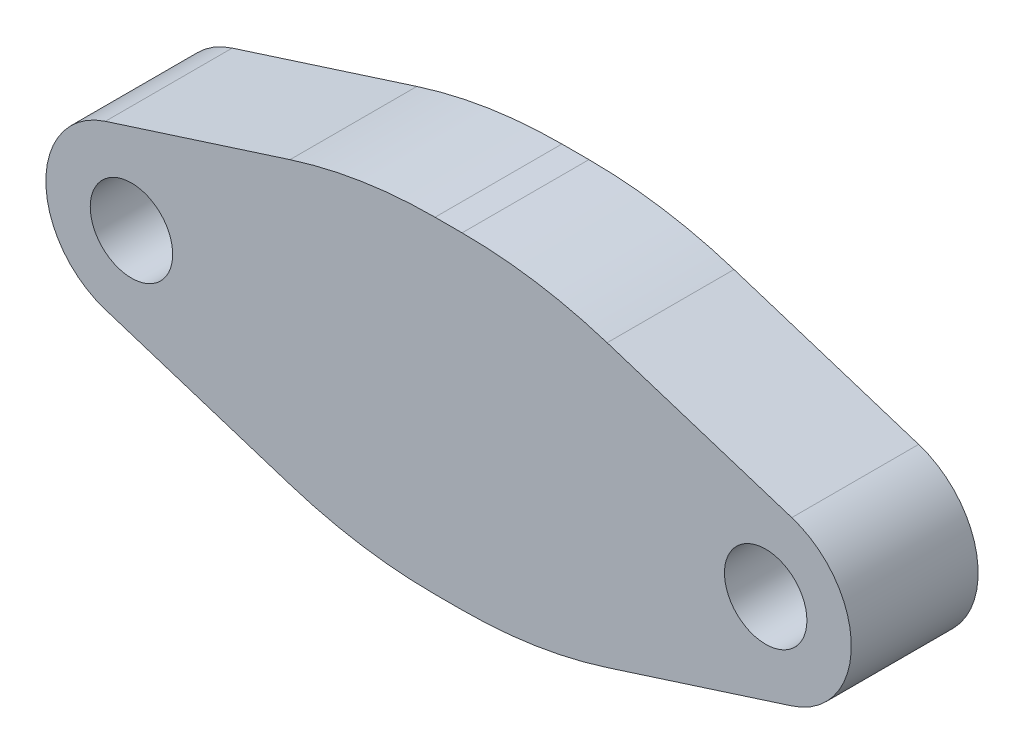
ISO-10303-21;
HEADER;
FILE_DESCRIPTION(('STEP AP214'),'2;1');
FILE_NAME('part.step','',(''),(''),'','','');
FILE_SCHEMA(('AUTOMOTIVE_DESIGN { 1 0 10303 214 1 1 1 1 }'));
ENDSEC;
DATA;
#1=APPLICATION_CONTEXT('core data for automotive mechanical design processes');
#2=APPLICATION_PROTOCOL_DEFINITION('international standard','automotive_design',2000,#1);
#3=PRODUCT_CONTEXT('',#1,'mechanical');
#4=PRODUCT('Part','Part','',(#3));
#5=PRODUCT_RELATED_PRODUCT_CATEGORY('part','',(#4));
#6=PRODUCT_DEFINITION_FORMATION('','',#4);
#7=PRODUCT_DEFINITION_CONTEXT('part definition',#1,'design');
#8=PRODUCT_DEFINITION('design','',#6,#7);
#9=PRODUCT_DEFINITION_SHAPE('','',#8);
#10=(LENGTH_UNIT() NAMED_UNIT(*) SI_UNIT(.MILLI.,.METRE.));
#11=(NAMED_UNIT(*) PLANE_ANGLE_UNIT() SI_UNIT($,.RADIAN.));
#12=(NAMED_UNIT(*) SI_UNIT($,.STERADIAN.) SOLID_ANGLE_UNIT());
#13=UNCERTAINTY_MEASURE_WITH_UNIT(LENGTH_MEASURE(1.E-05),#10,'distance_accuracy_value','');
#14=(GEOMETRIC_REPRESENTATION_CONTEXT(3) GLOBAL_UNCERTAINTY_ASSIGNED_CONTEXT((#13)) GLOBAL_UNIT_ASSIGNED_CONTEXT((#10,
#11,#12)) REPRESENTATION_CONTEXT('',''));
#15=CARTESIAN_POINT('',(0.,0.,0.));
#16=DIRECTION('',(0.,0.,1.));
#17=DIRECTION('',(1.,0.,0.));
#18=AXIS2_PLACEMENT_3D('',#15,#16,#17);
#19=CARTESIAN_POINT('',(4.33012701892219,0.,4.));
#20=DIRECTION('',(-0.866025403784439,-0.5,0.));
#21=DIRECTION('',(0.5,-0.866025403784439,0.));
#22=AXIS2_PLACEMENT_3D('',#19,#20,#21);
#23=PLANE('',#22);
#24=DIRECTION('',(0.,0.,-1.));
#25=VECTOR('',#24,1.);
#26=CARTESIAN_POINT('',(4.33012701892219,0.,4.));
#27=LINE('',#26,#25);
#28=CARTESIAN_POINT('',(4.33012701892219,0.,2.8));
#29=VERTEX_POINT('',#28);
#30=CARTESIAN_POINT('',(4.33012701892219,0.,0.));
#31=VERTEX_POINT('',#30);
#32=EDGE_CURVE('E56',#29,#31,#27,.T.);
#33=ORIENTED_EDGE('',*,*,#32,.F.);
#34=DIRECTION('',(-0.5,0.866025403784439,0.));
#35=VECTOR('',#34,1.);
#36=CARTESIAN_POINT('',(4.33012701892219,0.,2.8));
#37=LINE('',#36,#35);
#38=CARTESIAN_POINT('',(2.1650635094611,3.75,2.8));
#39=VERTEX_POINT('',#38);
#40=EDGE_CURVE('E50',#29,#39,#37,.T.);
#41=ORIENTED_EDGE('',*,*,#40,.T.);
#42=DIRECTION('',(0.,0.,-1.));
#43=VECTOR('',#42,1.);
#44=CARTESIAN_POINT('',(2.1650635094611,3.75,4.));
#45=LINE('',#44,#43);
#46=CARTESIAN_POINT('',(2.1650635094611,3.75,0.));
#47=VERTEX_POINT('',#46);
#48=EDGE_CURVE('E167',#39,#47,#45,.T.);
#49=ORIENTED_EDGE('',*,*,#48,.T.);
#50=DIRECTION('',(-0.5,0.866025403784439,0.));
#51=VECTOR('',#50,1.);
#52=CARTESIAN_POINT('',(4.33012701892219,0.,0.));
#53=LINE('',#52,#51);
#54=EDGE_CURVE('E169',#31,#47,#53,.T.);
#55=ORIENTED_EDGE('',*,*,#54,.F.);
#56=EDGE_LOOP('',(#33,#41,#49,#55));
#57=FACE_BOUND('',#56,.T.);
#58=ADVANCED_FACE('F35',(#57),#23,.T.);
#59=CARTESIAN_POINT('',(2.1650635094611,3.75,4.));
#60=DIRECTION('',(0.,-1.,0.));
#61=DIRECTION('',(0.,0.,-1.));
#62=AXIS2_PLACEMENT_3D('',#59,#60,#61);
#63=PLANE('',#62);
#64=ORIENTED_EDGE('',*,*,#48,.F.);
#65=DIRECTION('',(-1.,0.,0.));
#66=VECTOR('',#65,1.);
#67=CARTESIAN_POINT('',(2.1650635094611,3.75,2.8));
#68=LINE('',#67,#66);
#69=CARTESIAN_POINT('',(-2.1650635094611,3.75,2.8));
#70=VERTEX_POINT('',#69);
#71=EDGE_CURVE('E158',#39,#70,#68,.T.);
#72=ORIENTED_EDGE('',*,*,#71,.T.);
#73=DIRECTION('',(0.,0.,-1.));
#74=VECTOR('',#73,1.);
#75=CARTESIAN_POINT('',(-2.1650635094611,3.75,4.));
#76=LINE('',#75,#74);
#77=CARTESIAN_POINT('',(-2.1650635094611,3.75,0.));
#78=VERTEX_POINT('',#77);
#79=EDGE_CURVE('E176',#70,#78,#76,.T.);
#80=ORIENTED_EDGE('',*,*,#79,.T.);
#81=DIRECTION('',(-1.,0.,0.));
#82=VECTOR('',#81,1.);
#83=CARTESIAN_POINT('',(2.1650635094611,3.75,0.));
#84=LINE('',#83,#82);
#85=EDGE_CURVE('E173',#47,#78,#84,.T.);
#86=ORIENTED_EDGE('',*,*,#85,.F.);
#87=EDGE_LOOP('',(#64,#72,#80,#86));
#88=FACE_BOUND('',#87,.T.);
#89=ADVANCED_FACE('F171',(#88),#63,.T.);
#90=CARTESIAN_POINT('',(-2.1650635094611,3.75,4.));
#91=DIRECTION('',(0.866025403784439,-0.5,0.));
#92=DIRECTION('',(0.5,0.866025403784439,0.));
#93=AXIS2_PLACEMENT_3D('',#90,#91,#92);
#94=PLANE('',#93);
#95=ORIENTED_EDGE('',*,*,#79,.F.);
#96=DIRECTION('',(-0.5,-0.866025403784439,0.));
#97=VECTOR('',#96,1.);
#98=CARTESIAN_POINT('',(-2.1650635094611,3.75,2.8));
#99=LINE('',#98,#97);
#100=CARTESIAN_POINT('',(-4.33012701892219,0.,2.8));
#101=VERTEX_POINT('',#100);
#102=EDGE_CURVE('E161',#70,#101,#99,.T.);
#103=ORIENTED_EDGE('',*,*,#102,.T.);
#104=DIRECTION('',(0.,0.,-1.));
#105=VECTOR('',#104,1.);
#106=CARTESIAN_POINT('',(-4.33012701892219,0.,4.));
#107=LINE('',#106,#105);
#108=CARTESIAN_POINT('',(-4.33012701892219,0.,0.));
#109=VERTEX_POINT('',#108);
#110=EDGE_CURVE('E181',#101,#109,#107,.T.);
#111=ORIENTED_EDGE('',*,*,#110,.T.);
#112=DIRECTION('',(-0.5,-0.866025403784439,0.));
#113=VECTOR('',#112,1.);
#114=CARTESIAN_POINT('',(-2.1650635094611,3.75,0.));
#115=LINE('',#114,#113);
#116=EDGE_CURVE('E540',#78,#109,#115,.T.);
#117=ORIENTED_EDGE('',*,*,#116,.F.);
#118=EDGE_LOOP('',(#95,#103,#111,#117));
#119=FACE_BOUND('',#118,.T.);
#120=ADVANCED_FACE('F353',(#119),#94,.T.);
#121=CARTESIAN_POINT('',(-4.33012701892219,0.,4.));
#122=DIRECTION('',(0.866025403784439,0.5,0.));
#123=DIRECTION('',(-0.5,0.866025403784439,0.));
#124=AXIS2_PLACEMENT_3D('',#121,#122,#123);
#125=PLANE('',#124);
#126=ORIENTED_EDGE('',*,*,#110,.F.);
#127=DIRECTION('',(0.5,-0.866025403784439,0.));
#128=VECTOR('',#127,1.);
#129=CARTESIAN_POINT('',(-4.33012701892219,0.,2.8));
#130=LINE('',#129,#128);
#131=CARTESIAN_POINT('',(-2.1650635094611,-3.75,2.8));
#132=VERTEX_POINT('',#131);
#133=EDGE_CURVE('E562',#101,#132,#130,.T.);
#134=ORIENTED_EDGE('',*,*,#133,.T.);
#135=DIRECTION('',(0.,0.,-1.));
#136=VECTOR('',#135,1.);
#137=CARTESIAN_POINT('',(-2.1650635094611,-3.75,4.));
#138=LINE('',#137,#136);
#139=CARTESIAN_POINT('',(-2.1650635094611,-3.75,0.));
#140=VERTEX_POINT('',#139);
#141=EDGE_CURVE('E558',#132,#140,#138,.T.);
#142=ORIENTED_EDGE('',*,*,#141,.T.);
#143=DIRECTION('',(0.5,-0.866025403784439,0.));
#144=VECTOR('',#143,1.);
#145=CARTESIAN_POINT('',(-4.33012701892219,0.,0.));
#146=LINE('',#145,#144);
#147=EDGE_CURVE('E543',#109,#140,#146,.T.);
#148=ORIENTED_EDGE('',*,*,#147,.F.);
#149=EDGE_LOOP('',(#126,#134,#142,#148));
#150=FACE_BOUND('',#149,.T.);
#151=ADVANCED_FACE('F429',(#150),#125,.T.);
#152=CARTESIAN_POINT('',(-2.1650635094611,-3.75,4.));
#153=DIRECTION('',(0.,1.,0.));
#154=DIRECTION('',(0.,0.,1.));
#155=AXIS2_PLACEMENT_3D('',#152,#153,#154);
#156=PLANE('',#155);
#157=ORIENTED_EDGE('',*,*,#141,.F.);
#158=DIRECTION('',(1.,0.,0.));
#159=VECTOR('',#158,1.);
#160=CARTESIAN_POINT('',(-2.1650635094611,-3.75,2.8));
#161=LINE('',#160,#159);
#162=CARTESIAN_POINT('',(2.1650635094611,-3.75,2.8));
#163=VERTEX_POINT('',#162);
#164=EDGE_CURVE('E565',#132,#163,#161,.T.);
#165=ORIENTED_EDGE('',*,*,#164,.T.);
#166=DIRECTION('',(0.,0.,-1.));
#167=VECTOR('',#166,1.);
#168=CARTESIAN_POINT('',(2.1650635094611,-3.75,4.));
#169=LINE('',#168,#167);
#170=CARTESIAN_POINT('',(2.1650635094611,-3.75,0.));
#171=VERTEX_POINT('',#170);
#172=EDGE_CURVE('E556',#163,#171,#169,.T.);
#173=ORIENTED_EDGE('',*,*,#172,.T.);
#174=DIRECTION('',(1.,0.,0.));
#175=VECTOR('',#174,1.);
#176=CARTESIAN_POINT('',(-2.1650635094611,-3.75,0.));
#177=LINE('',#176,#175);
#178=EDGE_CURVE('E550',#140,#171,#177,.T.);
#179=ORIENTED_EDGE('',*,*,#178,.F.);
#180=EDGE_LOOP('',(#157,#165,#173,#179));
#181=FACE_BOUND('',#180,.T.);
#182=ADVANCED_FACE('F421',(#181),#156,.T.);
#183=CARTESIAN_POINT('',(2.1650635094611,-3.75,4.));
#184=DIRECTION('',(-0.866025403784439,0.5,0.));
#185=DIRECTION('',(-0.5,-0.866025403784439,0.));
#186=AXIS2_PLACEMENT_3D('',#183,#184,#185);
#187=PLANE('',#186);
#188=ORIENTED_EDGE('',*,*,#172,.F.);
#189=DIRECTION('',(0.5,0.866025403784439,0.));
#190=VECTOR('',#189,1.);
#191=CARTESIAN_POINT('',(2.1650635094611,-3.75,2.8));
#192=LINE('',#191,#190);
#193=EDGE_CURVE('E11',#163,#29,#192,.T.);
#194=ORIENTED_EDGE('',*,*,#193,.T.);
#195=ORIENTED_EDGE('',*,*,#32,.T.);
#196=DIRECTION('',(0.5,0.866025403784439,0.));
#197=VECTOR('',#196,1.);
#198=CARTESIAN_POINT('',(2.1650635094611,-3.75,0.));
#199=LINE('',#198,#197);
#200=EDGE_CURVE('E553',#171,#31,#199,.T.);
#201=ORIENTED_EDGE('',*,*,#200,.F.);
#202=EDGE_LOOP('',(#188,#194,#195,#201));
#203=FACE_BOUND('',#202,.T.);
#204=ADVANCED_FACE('F367',(#203),#187,.T.);
#205=CARTESIAN_POINT('',(-0.426426598898093,9.85,4.));
#206=DIRECTION('',(0.,0.,1.));
#207=DIRECTION('',(1.,0.,0.));
#208=AXIS2_PLACEMENT_3D('',#205,#206,#207);
#209=PLANE('',#208);
#210=CARTESIAN_POINT('',(-10.,0.,4.));
#211=DIRECTION('',(0.,0.,1.));
#212=DIRECTION('',(-1.,0.,0.));
#213=AXIS2_PLACEMENT_3D('',#210,#211,#212);
#214=CIRCLE('',#213,1.3);
#215=CARTESIAN_POINT('',(-11.3,0.,4.));
#216=VERTEX_POINT('',#215);
#217=EDGE_CURVE('E188',#216,#216,#214,.T.);
#218=ORIENTED_EDGE('',*,*,#217,.F.);
#219=EDGE_LOOP('',(#218));
#220=FACE_BOUND('',#219,.T.);
#221=CARTESIAN_POINT('',(-0.426426598898093,9.85,4.));
#222=DIRECTION('',(0.,0.,1.));
#223=DIRECTION('',(1.,0.,0.));
#224=AXIS2_PLACEMENT_3D('',#221,#222,#223);
#225=CIRCLE('',#224,15.);
#226=CARTESIAN_POINT('',(-5.,-4.4357420648958,4.));
#227=VERTEX_POINT('',#226);
#228=CARTESIAN_POINT('',(-0.426426598898093,-5.15,4.));
#229=VERTEX_POINT('',#228);
#230=EDGE_CURVE('E194',#227,#229,#225,.T.);
#231=ORIENTED_EDGE('',*,*,#230,.T.);
#232=DIRECTION('',(1.,0.,0.));
#233=VECTOR('',#232,1.);
#234=CARTESIAN_POINT('',(0.426426598898093,-5.15,4.));
#235=LINE('',#234,#233);
#236=CARTESIAN_POINT('',(0.426426598898093,-5.15,4.));
#237=VERTEX_POINT('',#236);
#238=EDGE_CURVE('E197',#229,#237,#235,.T.);
#239=ORIENTED_EDGE('',*,*,#238,.T.);
#240=CARTESIAN_POINT('',(0.426426598898093,9.85,4.));
#241=DIRECTION('',(0.,0.,1.));
#242=DIRECTION('',(-1.,0.,0.));
#243=AXIS2_PLACEMENT_3D('',#240,#241,#242);
#244=CIRCLE('',#243,15.);
#245=CARTESIAN_POINT('',(5.,-4.43574206489579,4.));
#246=VERTEX_POINT('',#245);
#247=EDGE_CURVE('E200',#237,#246,#244,.T.);
#248=ORIENTED_EDGE('',*,*,#247,.T.);
#249=DIRECTION('',(0.952382804326386,0.304904893406794,0.));
#250=VECTOR('',#249,1.);
#251=CARTESIAN_POINT('',(10.8232432121983,-2.57143357168124,4.));
#252=LINE('',#251,#250);
#253=CARTESIAN_POINT('',(10.8232432121983,-2.57143357168124,4.));
#254=VERTEX_POINT('',#253);
#255=EDGE_CURVE('E202',#246,#254,#252,.T.);
#256=ORIENTED_EDGE('',*,*,#255,.T.);
#257=CARTESIAN_POINT('',(10.,0.,4.));
#258=DIRECTION('',(0.,0.,1.));
#259=DIRECTION('',(1.,0.,0.));
#260=AXIS2_PLACEMENT_3D('',#257,#258,#259);
#261=CIRCLE('',#260,2.7);
#262=CARTESIAN_POINT('',(10.8232432121983,2.57143357168124,4.));
#263=VERTEX_POINT('',#262);
#264=EDGE_CURVE('E204',#254,#263,#261,.T.);
#265=ORIENTED_EDGE('',*,*,#264,.T.);
#266=DIRECTION('',(-0.952382804326386,0.304904893406794,0.));
#267=VECTOR('',#266,1.);
#268=CARTESIAN_POINT('',(10.8232432121983,2.57143357168124,4.));
#269=LINE('',#268,#267);
#270=CARTESIAN_POINT('',(5.,4.4357420648958,4.));
#271=VERTEX_POINT('',#270);
#272=EDGE_CURVE('E206',#263,#271,#269,.T.);
#273=ORIENTED_EDGE('',*,*,#272,.T.);
#274=CARTESIAN_POINT('',(0.426426598898093,-9.85,4.));
#275=DIRECTION('',(0.,0.,1.));
#276=DIRECTION('',(1.,0.,0.));
#277=AXIS2_PLACEMENT_3D('',#274,#275,#276);
#278=CIRCLE('',#277,15.);
#279=CARTESIAN_POINT('',(0.426426598898094,5.15,4.));
#280=VERTEX_POINT('',#279);
#281=EDGE_CURVE('E208',#271,#280,#278,.T.);
#282=ORIENTED_EDGE('',*,*,#281,.T.);
#283=DIRECTION('',(-1.,0.,0.));
#284=VECTOR('',#283,1.);
#285=CARTESIAN_POINT('',(0.426426598898093,5.15,4.));
#286=LINE('',#285,#284);
#287=CARTESIAN_POINT('',(-0.426426598898093,5.15,4.));
#288=VERTEX_POINT('',#287);
#289=EDGE_CURVE('E210',#280,#288,#286,.T.);
#290=ORIENTED_EDGE('',*,*,#289,.T.);
#291=CARTESIAN_POINT('',(-0.426426598898093,-9.85,4.));
#292=DIRECTION('',(0.,0.,1.));
#293=DIRECTION('',(-1.,0.,0.));
#294=AXIS2_PLACEMENT_3D('',#291,#292,#293);
#295=CIRCLE('',#294,15.);
#296=CARTESIAN_POINT('',(-5.,4.4357420648958,4.));
#297=VERTEX_POINT('',#296);
#298=EDGE_CURVE('E212',#288,#297,#295,.T.);
#299=ORIENTED_EDGE('',*,*,#298,.T.);
#300=DIRECTION('',(-0.952382804326386,-0.304904893406794,0.));
#301=VECTOR('',#300,1.);
#302=CARTESIAN_POINT('',(-10.8232432121983,2.57143357168124,4.));
#303=LINE('',#302,#301);
#304=CARTESIAN_POINT('',(-10.8232432121983,2.57143357168124,4.));
#305=VERTEX_POINT('',#304);
#306=EDGE_CURVE('E214',#297,#305,#303,.T.);
#307=ORIENTED_EDGE('',*,*,#306,.T.);
#308=CARTESIAN_POINT('',(-10.,0.,4.));
#309=DIRECTION('',(0.,0.,1.));
#310=DIRECTION('',(-1.,0.,0.));
#311=AXIS2_PLACEMENT_3D('',#308,#309,#310);
#312=CIRCLE('',#311,2.7);
#313=CARTESIAN_POINT('',(-10.8232432121983,-2.57143357168125,4.));
#314=VERTEX_POINT('',#313);
#315=EDGE_CURVE('E216',#305,#314,#312,.T.);
#316=ORIENTED_EDGE('',*,*,#315,.T.);
#317=DIRECTION('',(0.952382804326386,-0.304904893406794,0.));
#318=VECTOR('',#317,1.);
#319=CARTESIAN_POINT('',(-10.8232432121983,-2.57143357168124,4.));
#320=LINE('',#319,#318);
#321=EDGE_CURVE('E218',#314,#227,#320,.T.);
#322=ORIENTED_EDGE('',*,*,#321,.T.);
#323=EDGE_LOOP('',(#231,#239,#248,#256,#265,#273,#282,#290,#299,#307,#316,#322));
#324=FACE_BOUND('',#323,.T.);
#325=CARTESIAN_POINT('',(10.,0.,4.));
#326=DIRECTION('',(0.,0.,1.));
#327=DIRECTION('',(1.,0.,0.));
#328=AXIS2_PLACEMENT_3D('',#325,#326,#327);
#329=CIRCLE('',#328,1.3);
#330=CARTESIAN_POINT('',(11.3,0.,4.));
#331=VERTEX_POINT('',#330);
#332=EDGE_CURVE('E179',#331,#331,#329,.T.);
#333=ORIENTED_EDGE('',*,*,#332,.F.);
#334=EDGE_LOOP('',(#333));
#335=FACE_BOUND('',#334,.T.);
#336=ADVANCED_FACE('F302',(#220,#324,#335),#209,.T.);
#337=CARTESIAN_POINT('',(-0.426426598898093,9.85,0.));
#338=DIRECTION('',(0.,0.,1.));
#339=DIRECTION('',(1.,0.,0.));
#340=AXIS2_PLACEMENT_3D('',#337,#338,#339);
#341=PLANE('',#340);
#342=CARTESIAN_POINT('',(10.,0.,0.));
#343=DIRECTION('',(0.,0.,1.));
#344=DIRECTION('',(1.,0.,0.));
#345=AXIS2_PLACEMENT_3D('',#342,#343,#344);
#346=CIRCLE('',#345,1.3);
#347=CARTESIAN_POINT('',(11.3,0.,0.));
#348=VERTEX_POINT('',#347);
#349=EDGE_CURVE('E175',#348,#348,#346,.T.);
#350=ORIENTED_EDGE('',*,*,#349,.T.);
#351=EDGE_LOOP('',(#350));
#352=FACE_BOUND('',#351,.T.);
#353=CARTESIAN_POINT('',(-10.,0.,0.));
#354=DIRECTION('',(0.,0.,1.));
#355=DIRECTION('',(-1.,0.,0.));
#356=AXIS2_PLACEMENT_3D('',#353,#354,#355);
#357=CIRCLE('',#356,1.3);
#358=CARTESIAN_POINT('',(-11.3,0.,0.));
#359=VERTEX_POINT('',#358);
#360=EDGE_CURVE('E186',#359,#359,#357,.T.);
#361=ORIENTED_EDGE('',*,*,#360,.T.);
#362=EDGE_LOOP('',(#361));
#363=FACE_BOUND('',#362,.T.);
#364=CARTESIAN_POINT('',(-0.426426598898093,9.85,0.));
#365=DIRECTION('',(0.,0.,1.));
#366=DIRECTION('',(1.,0.,0.));
#367=AXIS2_PLACEMENT_3D('',#364,#365,#366);
#368=CIRCLE('',#367,15.);
#369=CARTESIAN_POINT('',(-5.,-4.4357420648958,0.));
#370=VERTEX_POINT('',#369);
#371=CARTESIAN_POINT('',(-0.426426598898093,-5.15,0.));
#372=VERTEX_POINT('',#371);
#373=EDGE_CURVE('E191',#370,#372,#368,.T.);
#374=ORIENTED_EDGE('',*,*,#373,.F.);
#375=DIRECTION('',(0.952382804326386,-0.304904893406794,0.));
#376=VECTOR('',#375,1.);
#377=CARTESIAN_POINT('',(-10.8232432121983,-2.57143357168124,0.));
#378=LINE('',#377,#376);
#379=CARTESIAN_POINT('',(-10.8232432121983,-2.57143357168125,0.));
#380=VERTEX_POINT('',#379);
#381=EDGE_CURVE('E198',#380,#370,#378,.T.);
#382=ORIENTED_EDGE('',*,*,#381,.F.);
#383=CARTESIAN_POINT('',(-10.,0.,0.));
#384=DIRECTION('',(0.,0.,1.));
#385=DIRECTION('',(-1.,0.,0.));
#386=AXIS2_PLACEMENT_3D('',#383,#384,#385);
#387=CIRCLE('',#386,2.7);
#388=CARTESIAN_POINT('',(-10.8232432121983,2.57143357168124,0.));
#389=VERTEX_POINT('',#388);
#390=EDGE_CURVE('E241',#389,#380,#387,.T.);
#391=ORIENTED_EDGE('',*,*,#390,.F.);
#392=DIRECTION('',(-0.952382804326386,-0.304904893406794,0.));
#393=VECTOR('',#392,1.);
#394=CARTESIAN_POINT('',(-10.8232432121983,2.57143357168124,0.));
#395=LINE('',#394,#393);
#396=CARTESIAN_POINT('',(-5.,4.4357420648958,0.));
#397=VERTEX_POINT('',#396);
#398=EDGE_CURVE('E239',#397,#389,#395,.T.);
#399=ORIENTED_EDGE('',*,*,#398,.F.);
#400=CARTESIAN_POINT('',(-0.426426598898093,-9.85,0.));
#401=DIRECTION('',(0.,0.,1.));
#402=DIRECTION('',(-1.,0.,0.));
#403=AXIS2_PLACEMENT_3D('',#400,#401,#402);
#404=CIRCLE('',#403,15.);
#405=CARTESIAN_POINT('',(-0.426426598898093,5.15,0.));
#406=VERTEX_POINT('',#405);
#407=EDGE_CURVE('E237',#406,#397,#404,.T.);
#408=ORIENTED_EDGE('',*,*,#407,.F.);
#409=DIRECTION('',(-1.,0.,0.));
#410=VECTOR('',#409,1.);
#411=CARTESIAN_POINT('',(0.426426598898093,5.15,0.));
#412=LINE('',#411,#410);
#413=CARTESIAN_POINT('',(0.426426598898094,5.15,0.));
#414=VERTEX_POINT('',#413);
#415=EDGE_CURVE('E235',#414,#406,#412,.T.);
#416=ORIENTED_EDGE('',*,*,#415,.F.);
#417=CARTESIAN_POINT('',(0.426426598898093,-9.85,0.));
#418=DIRECTION('',(0.,0.,1.));
#419=DIRECTION('',(1.,0.,0.));
#420=AXIS2_PLACEMENT_3D('',#417,#418,#419);
#421=CIRCLE('',#420,15.);
#422=CARTESIAN_POINT('',(5.,4.4357420648958,0.));
#423=VERTEX_POINT('',#422);
#424=EDGE_CURVE('E233',#423,#414,#421,.T.);
#425=ORIENTED_EDGE('',*,*,#424,.F.);
#426=DIRECTION('',(-0.952382804326386,0.304904893406794,0.));
#427=VECTOR('',#426,1.);
#428=CARTESIAN_POINT('',(10.8232432121983,2.57143357168124,0.));
#429=LINE('',#428,#427);
#430=CARTESIAN_POINT('',(10.8232432121983,2.57143357168124,0.));
#431=VERTEX_POINT('',#430);
#432=EDGE_CURVE('E231',#431,#423,#429,.T.);
#433=ORIENTED_EDGE('',*,*,#432,.F.);
#434=CARTESIAN_POINT('',(10.,0.,0.));
#435=DIRECTION('',(0.,0.,1.));
#436=DIRECTION('',(1.,0.,0.));
#437=AXIS2_PLACEMENT_3D('',#434,#435,#436);
#438=CIRCLE('',#437,2.7);
#439=CARTESIAN_POINT('',(10.8232432121983,-2.57143357168124,0.));
#440=VERTEX_POINT('',#439);
#441=EDGE_CURVE('E229',#440,#431,#438,.T.);
#442=ORIENTED_EDGE('',*,*,#441,.F.);
#443=DIRECTION('',(0.952382804326386,0.304904893406794,0.));
#444=VECTOR('',#443,1.);
#445=CARTESIAN_POINT('',(10.8232432121983,-2.57143357168124,0.));
#446=LINE('',#445,#444);
#447=CARTESIAN_POINT('',(5.,-4.43574206489579,0.));
#448=VERTEX_POINT('',#447);
#449=EDGE_CURVE('E227',#448,#440,#446,.T.);
#450=ORIENTED_EDGE('',*,*,#449,.F.);
#451=CARTESIAN_POINT('',(0.426426598898093,9.85,0.));
#452=DIRECTION('',(0.,0.,1.));
#453=DIRECTION('',(-1.,0.,0.));
#454=AXIS2_PLACEMENT_3D('',#451,#452,#453);
#455=CIRCLE('',#454,15.);
#456=CARTESIAN_POINT('',(0.426426598898093,-5.15,0.));
#457=VERTEX_POINT('',#456);
#458=EDGE_CURVE('E225',#457,#448,#455,.T.);
#459=ORIENTED_EDGE('',*,*,#458,.F.);
#460=DIRECTION('',(1.,0.,0.));
#461=VECTOR('',#460,1.);
#462=CARTESIAN_POINT('',(0.426426598898093,-5.15,0.));
#463=LINE('',#462,#461);
#464=EDGE_CURVE('E223',#372,#457,#463,.T.);
#465=ORIENTED_EDGE('',*,*,#464,.F.);
#466=EDGE_LOOP('',(#374,#382,#391,#399,#408,#416,#425,#433,#442,#450,#459,#465));
#467=FACE_BOUND('',#466,.T.);
#468=ORIENTED_EDGE('',*,*,#54,.T.);
#469=ORIENTED_EDGE('',*,*,#85,.T.);
#470=ORIENTED_EDGE('',*,*,#116,.T.);
#471=ORIENTED_EDGE('',*,*,#147,.T.);
#472=ORIENTED_EDGE('',*,*,#178,.T.);
#473=ORIENTED_EDGE('',*,*,#200,.T.);
#474=EDGE_LOOP('',(#468,#469,#470,#471,#472,#473));
#475=FACE_BOUND('',#474,.T.);
#476=ADVANCED_FACE('F286',(#352,#363,#467,#475),#341,.F.);
#477=CARTESIAN_POINT('',(-0.426426598898093,9.85,4.));
#478=DIRECTION('',(0.,0.,-1.));
#479=DIRECTION('',(-1.,0.,0.));
#480=AXIS2_PLACEMENT_3D('',#477,#478,#479);
#481=CYLINDRICAL_SURFACE('',#480,15.);
#482=ORIENTED_EDGE('',*,*,#373,.T.);
#483=DIRECTION('',(0.,0.,-1.));
#484=VECTOR('',#483,1.);
#485=CARTESIAN_POINT('',(-0.426426598898093,-5.15,4.));
#486=LINE('',#485,#484);
#487=EDGE_CURVE('E43',#229,#372,#486,.T.);
#488=ORIENTED_EDGE('',*,*,#487,.F.);
#489=ORIENTED_EDGE('',*,*,#230,.F.);
#490=DIRECTION('',(0.,0.,-1.));
#491=VECTOR('',#490,1.);
#492=CARTESIAN_POINT('',(-5.,-4.4357420648958,4.));
#493=LINE('',#492,#491);
#494=EDGE_CURVE('E220',#227,#370,#493,.T.);
#495=ORIENTED_EDGE('',*,*,#494,.T.);
#496=EDGE_LOOP('',(#482,#488,#489,#495));
#497=FACE_BOUND('',#496,.T.);
#498=ADVANCED_FACE('F37',(#497),#481,.T.);
#499=CARTESIAN_POINT('',(0.426426598898093,-5.15,4.));
#500=DIRECTION('',(0.,1.,0.));
#501=DIRECTION('',(0.,0.,1.));
#502=AXIS2_PLACEMENT_3D('',#499,#500,#501);
#503=PLANE('',#502);
#504=ORIENTED_EDGE('',*,*,#464,.T.);
#505=DIRECTION('',(0.,0.,-1.));
#506=VECTOR('',#505,1.);
#507=CARTESIAN_POINT('',(0.426426598898093,-5.15,4.));
#508=LINE('',#507,#506);
#509=EDGE_CURVE('E273',#237,#457,#508,.T.);
#510=ORIENTED_EDGE('',*,*,#509,.F.);
#511=ORIENTED_EDGE('',*,*,#238,.F.);
#512=ORIENTED_EDGE('',*,*,#487,.T.);
#513=EDGE_LOOP('',(#504,#510,#511,#512));
#514=FACE_BOUND('',#513,.T.);
#515=ADVANCED_FACE('F278',(#514),#503,.F.);
#516=CARTESIAN_POINT('',(0.426426598898093,9.85,4.));
#517=DIRECTION('',(0.,0.,-1.));
#518=DIRECTION('',(-1.,0.,0.));
#519=AXIS2_PLACEMENT_3D('',#516,#517,#518);
#520=CYLINDRICAL_SURFACE('',#519,15.);
#521=ORIENTED_EDGE('',*,*,#458,.T.);
#522=DIRECTION('',(0.,0.,-1.));
#523=VECTOR('',#522,1.);
#524=CARTESIAN_POINT('',(5.,-4.43574206489579,4.));
#525=LINE('',#524,#523);
#526=EDGE_CURVE('E270',#246,#448,#525,.T.);
#527=ORIENTED_EDGE('',*,*,#526,.F.);
#528=ORIENTED_EDGE('',*,*,#247,.F.);
#529=ORIENTED_EDGE('',*,*,#509,.T.);
#530=EDGE_LOOP('',(#521,#527,#528,#529));
#531=FACE_BOUND('',#530,.T.);
#532=ADVANCED_FACE('F294',(#531),#520,.T.);
#533=CARTESIAN_POINT('',(10.8232432121983,-2.57143357168124,4.));
#534=DIRECTION('',(-0.304904893406795,0.952382804326386,0.));
#535=DIRECTION('',(-0.952382804326386,-0.304904893406795,0.));
#536=AXIS2_PLACEMENT_3D('',#533,#534,#535);
#537=PLANE('',#536);
#538=ORIENTED_EDGE('',*,*,#449,.T.);
#539=DIRECTION('',(0.,0.,-1.));
#540=VECTOR('',#539,1.);
#541=CARTESIAN_POINT('',(10.8232432121983,-2.57143357168124,4.));
#542=LINE('',#541,#540);
#543=EDGE_CURVE('E267',#254,#440,#542,.T.);
#544=ORIENTED_EDGE('',*,*,#543,.F.);
#545=ORIENTED_EDGE('',*,*,#255,.F.);
#546=ORIENTED_EDGE('',*,*,#526,.T.);
#547=EDGE_LOOP('',(#538,#544,#545,#546));
#548=FACE_BOUND('',#547,.T.);
#549=ADVANCED_FACE('F298',(#548),#537,.F.);
#550=CARTESIAN_POINT('',(10.,0.,4.));
#551=DIRECTION('',(0.,0.,-1.));
#552=DIRECTION('',(-1.,0.,0.));
#553=AXIS2_PLACEMENT_3D('',#550,#551,#552);
#554=CYLINDRICAL_SURFACE('',#553,2.7);
#555=ORIENTED_EDGE('',*,*,#441,.T.);
#556=DIRECTION('',(0.,0.,-1.));
#557=VECTOR('',#556,1.);
#558=CARTESIAN_POINT('',(10.8232432121983,2.57143357168124,4.));
#559=LINE('',#558,#557);
#560=EDGE_CURVE('E264',#263,#431,#559,.T.);
#561=ORIENTED_EDGE('',*,*,#560,.F.);
#562=ORIENTED_EDGE('',*,*,#264,.F.);
#563=ORIENTED_EDGE('',*,*,#543,.T.);
#564=EDGE_LOOP('',(#555,#561,#562,#563));
#565=FACE_BOUND('',#564,.T.);
#566=ADVANCED_FACE('F338',(#565),#554,.T.);
#567=CARTESIAN_POINT('',(10.8232432121983,2.57143357168124,4.));
#568=DIRECTION('',(-0.304904893406795,-0.952382804326386,0.));
#569=DIRECTION('',(0.952382804326386,-0.304904893406795,0.));
#570=AXIS2_PLACEMENT_3D('',#567,#568,#569);
#571=PLANE('',#570);
#572=ORIENTED_EDGE('',*,*,#432,.T.);
#573=DIRECTION('',(0.,0.,-1.));
#574=VECTOR('',#573,1.);
#575=CARTESIAN_POINT('',(5.,4.4357420648958,4.));
#576=LINE('',#575,#574);
#577=EDGE_CURVE('E261',#271,#423,#576,.T.);
#578=ORIENTED_EDGE('',*,*,#577,.F.);
#579=ORIENTED_EDGE('',*,*,#272,.F.);
#580=ORIENTED_EDGE('',*,*,#560,.T.);
#581=EDGE_LOOP('',(#572,#578,#579,#580));
#582=FACE_BOUND('',#581,.T.);
#583=ADVANCED_FACE('F336',(#582),#571,.F.);
#584=CARTESIAN_POINT('',(0.426426598898093,-9.85,4.));
#585=DIRECTION('',(0.,0.,-1.));
#586=DIRECTION('',(-1.,0.,0.));
#587=AXIS2_PLACEMENT_3D('',#584,#585,#586);
#588=CYLINDRICAL_SURFACE('',#587,15.);
#589=ORIENTED_EDGE('',*,*,#424,.T.);
#590=DIRECTION('',(0.,0.,-1.));
#591=VECTOR('',#590,1.);
#592=CARTESIAN_POINT('',(0.426426598898094,5.15,4.));
#593=LINE('',#592,#591);
#594=EDGE_CURVE('E258',#280,#414,#593,.T.);
#595=ORIENTED_EDGE('',*,*,#594,.F.);
#596=ORIENTED_EDGE('',*,*,#281,.F.);
#597=ORIENTED_EDGE('',*,*,#577,.T.);
#598=EDGE_LOOP('',(#589,#595,#596,#597));
#599=FACE_BOUND('',#598,.T.);
#600=ADVANCED_FACE('F331',(#599),#588,.T.);
#601=CARTESIAN_POINT('',(0.426426598898093,5.15,4.));
#602=DIRECTION('',(0.,-1.,0.));
#603=DIRECTION('',(0.,0.,-1.));
#604=AXIS2_PLACEMENT_3D('',#601,#602,#603);
#605=PLANE('',#604);
#606=ORIENTED_EDGE('',*,*,#415,.T.);
#607=DIRECTION('',(0.,0.,-1.));
#608=VECTOR('',#607,1.);
#609=CARTESIAN_POINT('',(-0.426426598898093,5.15,4.));
#610=LINE('',#609,#608);
#611=EDGE_CURVE('E255',#288,#406,#610,.T.);
#612=ORIENTED_EDGE('',*,*,#611,.F.);
#613=ORIENTED_EDGE('',*,*,#289,.F.);
#614=ORIENTED_EDGE('',*,*,#594,.T.);
#615=EDGE_LOOP('',(#606,#612,#613,#614));
#616=FACE_BOUND('',#615,.T.);
#617=ADVANCED_FACE('F326',(#616),#605,.F.);
#618=CARTESIAN_POINT('',(-0.426426598898093,-9.85,4.));
#619=DIRECTION('',(0.,0.,-1.));
#620=DIRECTION('',(-1.,0.,0.));
#621=AXIS2_PLACEMENT_3D('',#618,#619,#620);
#622=CYLINDRICAL_SURFACE('',#621,15.);
#623=ORIENTED_EDGE('',*,*,#407,.T.);
#624=DIRECTION('',(0.,0.,-1.));
#625=VECTOR('',#624,1.);
#626=CARTESIAN_POINT('',(-5.,4.4357420648958,4.));
#627=LINE('',#626,#625);
#628=EDGE_CURVE('E252',#297,#397,#627,.T.);
#629=ORIENTED_EDGE('',*,*,#628,.F.);
#630=ORIENTED_EDGE('',*,*,#298,.F.);
#631=ORIENTED_EDGE('',*,*,#611,.T.);
#632=EDGE_LOOP('',(#623,#629,#630,#631));
#633=FACE_BOUND('',#632,.T.);
#634=ADVANCED_FACE('F322',(#633),#622,.T.);
#635=CARTESIAN_POINT('',(-10.8232432121983,2.57143357168124,4.));
#636=DIRECTION('',(0.304904893406795,-0.952382804326386,0.));
#637=DIRECTION('',(0.952382804326386,0.304904893406795,0.));
#638=AXIS2_PLACEMENT_3D('',#635,#636,#637);
#639=PLANE('',#638);
#640=ORIENTED_EDGE('',*,*,#398,.T.);
#641=DIRECTION('',(0.,0.,-1.));
#642=VECTOR('',#641,1.);
#643=CARTESIAN_POINT('',(-10.8232432121983,2.57143357168124,4.));
#644=LINE('',#643,#642);
#645=EDGE_CURVE('E249',#305,#389,#644,.T.);
#646=ORIENTED_EDGE('',*,*,#645,.F.);
#647=ORIENTED_EDGE('',*,*,#306,.F.);
#648=ORIENTED_EDGE('',*,*,#628,.T.);
#649=EDGE_LOOP('',(#640,#646,#647,#648));
#650=FACE_BOUND('',#649,.T.);
#651=ADVANCED_FACE('F317',(#650),#639,.F.);
#652=CARTESIAN_POINT('',(-10.,0.,4.));
#653=DIRECTION('',(0.,0.,-1.));
#654=DIRECTION('',(-1.,0.,0.));
#655=AXIS2_PLACEMENT_3D('',#652,#653,#654);
#656=CYLINDRICAL_SURFACE('',#655,2.7);
#657=ORIENTED_EDGE('',*,*,#390,.T.);
#658=DIRECTION('',(0.,0.,-1.));
#659=VECTOR('',#658,1.);
#660=CARTESIAN_POINT('',(-10.8232432121983,-2.57143357168125,4.));
#661=LINE('',#660,#659);
#662=EDGE_CURVE('E246',#314,#380,#661,.T.);
#663=ORIENTED_EDGE('',*,*,#662,.F.);
#664=ORIENTED_EDGE('',*,*,#315,.F.);
#665=ORIENTED_EDGE('',*,*,#645,.T.);
#666=EDGE_LOOP('',(#657,#663,#664,#665));
#667=FACE_BOUND('',#666,.T.);
#668=ADVANCED_FACE('F311',(#667),#656,.T.);
#669=CARTESIAN_POINT('',(-10.8232432121983,-2.57143357168124,4.));
#670=DIRECTION('',(0.304904893406795,0.952382804326386,0.));
#671=DIRECTION('',(-0.952382804326386,0.304904893406795,0.));
#672=AXIS2_PLACEMENT_3D('',#669,#670,#671);
#673=PLANE('',#672);
#674=ORIENTED_EDGE('',*,*,#381,.T.);
#675=ORIENTED_EDGE('',*,*,#494,.F.);
#676=ORIENTED_EDGE('',*,*,#321,.F.);
#677=ORIENTED_EDGE('',*,*,#662,.T.);
#678=EDGE_LOOP('',(#674,#675,#676,#677));
#679=FACE_BOUND('',#678,.T.);
#680=ADVANCED_FACE('F309',(#679),#673,.F.);
#681=CARTESIAN_POINT('',(-10.,0.,4.));
#682=DIRECTION('',(0.,0.,-1.));
#683=DIRECTION('',(-1.,0.,0.));
#684=AXIS2_PLACEMENT_3D('',#681,#682,#683);
#685=CYLINDRICAL_SURFACE('',#684,1.3);
#686=ORIENTED_EDGE('',*,*,#217,.T.);
#687=EDGE_LOOP('',(#686));
#688=FACE_BOUND('',#687,.T.);
#689=ORIENTED_EDGE('',*,*,#360,.F.);
#690=EDGE_LOOP('',(#689));
#691=FACE_BOUND('',#690,.T.);
#692=ADVANCED_FACE('F360',(#688,#691),#685,.F.);
#693=CARTESIAN_POINT('',(10.,0.,4.));
#694=DIRECTION('',(0.,0.,-1.));
#695=DIRECTION('',(-1.,0.,0.));
#696=AXIS2_PLACEMENT_3D('',#693,#694,#695);
#697=CYLINDRICAL_SURFACE('',#696,1.3);
#698=ORIENTED_EDGE('',*,*,#332,.T.);
#699=EDGE_LOOP('',(#698));
#700=FACE_BOUND('',#699,.T.);
#701=ORIENTED_EDGE('',*,*,#349,.F.);
#702=EDGE_LOOP('',(#701));
#703=FACE_BOUND('',#702,.T.);
#704=ADVANCED_FACE('F357',(#700,#703),#697,.F.);
#705=CARTESIAN_POINT('',(0.,0.,2.8));
#706=DIRECTION('',(0.,0.,1.));
#707=DIRECTION('',(1.,0.,0.));
#708=AXIS2_PLACEMENT_3D('',#705,#706,#707);
#709=PLANE('',#708);
#710=ORIENTED_EDGE('',*,*,#40,.F.);
#711=ORIENTED_EDGE('',*,*,#193,.F.);
#712=ORIENTED_EDGE('',*,*,#164,.F.);
#713=ORIENTED_EDGE('',*,*,#133,.F.);
#714=ORIENTED_EDGE('',*,*,#102,.F.);
#715=ORIENTED_EDGE('',*,*,#71,.F.);
#716=EDGE_LOOP('',(#710,#711,#712,#713,#714,#715));
#717=FACE_BOUND('',#716,.T.);
#718=ADVANCED_FACE('F159',(#717),#709,.F.);
#719=CLOSED_SHELL('',(#58,#89,#120,#151,#182,#204,#336,#476,#498,#515,#532,#549,#566,#583,#600,
#617,#634,#651,#668,#680,#692,#704,#718));
#720=MANIFOLD_SOLID_BREP('B2',#719);
#721=ADVANCED_BREP_SHAPE_REPRESENTATION('',(#18,#720),#14);
#722=SHAPE_DEFINITION_REPRESENTATION(#9,#721);
ENDSEC;
END-ISO-10303-21;
